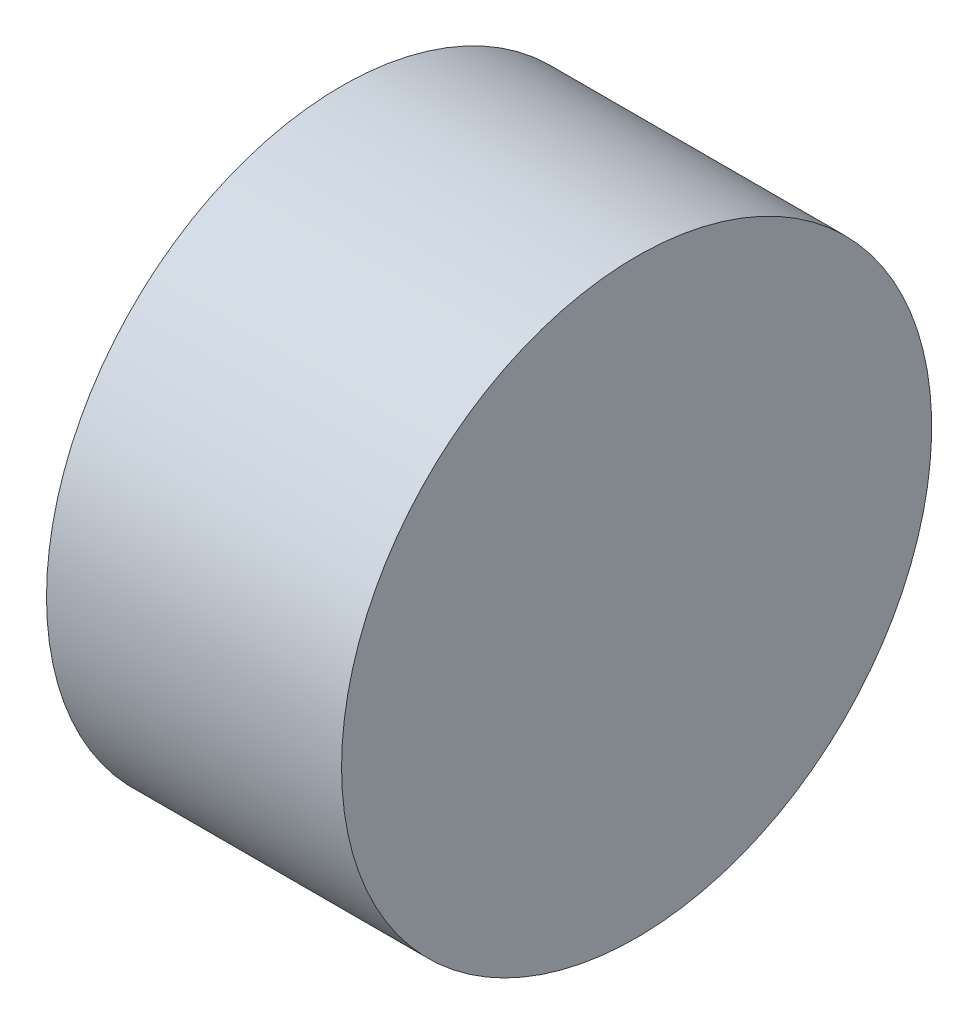
ISO-10303-21;
HEADER;
FILE_DESCRIPTION(('STEP AP214'),'2;1');
FILE_NAME('part.step','',(''),(''),'','','');
FILE_SCHEMA(('AUTOMOTIVE_DESIGN { 1 0 10303 214 1 1 1 1 }'));
ENDSEC;
DATA;
#1=APPLICATION_CONTEXT('core data for automotive mechanical design processes');
#2=APPLICATION_PROTOCOL_DEFINITION('international standard','automotive_design',2000,#1);
#3=PRODUCT_CONTEXT('',#1,'mechanical');
#4=PRODUCT('Part','Part','',(#3));
#5=PRODUCT_RELATED_PRODUCT_CATEGORY('part','',(#4));
#6=PRODUCT_DEFINITION_FORMATION('','',#4);
#7=PRODUCT_DEFINITION_CONTEXT('part definition',#1,'design');
#8=PRODUCT_DEFINITION('design','',#6,#7);
#9=PRODUCT_DEFINITION_SHAPE('','',#8);
#10=(LENGTH_UNIT() NAMED_UNIT(*) SI_UNIT(.MILLI.,.METRE.));
#11=(NAMED_UNIT(*) PLANE_ANGLE_UNIT() SI_UNIT($,.RADIAN.));
#12=(NAMED_UNIT(*) SI_UNIT($,.STERADIAN.) SOLID_ANGLE_UNIT());
#13=UNCERTAINTY_MEASURE_WITH_UNIT(LENGTH_MEASURE(1.E-05),#10,'distance_accuracy_value','');
#14=(GEOMETRIC_REPRESENTATION_CONTEXT(3) GLOBAL_UNCERTAINTY_ASSIGNED_CONTEXT((#13)) GLOBAL_UNIT_ASSIGNED_CONTEXT((#10,
#11,#12)) REPRESENTATION_CONTEXT('',''));
#15=CARTESIAN_POINT('',(0.,0.,0.));
#16=DIRECTION('',(0.,0.,1.));
#17=DIRECTION('',(1.,0.,0.));
#18=AXIS2_PLACEMENT_3D('',#15,#16,#17);
#19=CARTESIAN_POINT('',(13.5,12.7,0.));
#20=DIRECTION('',(0.,-1.,0.));
#21=DIRECTION('',(0.,0.,-1.));
#22=AXIS2_PLACEMENT_3D('',#19,#20,#21);
#23=PLANE('',#22);
#24=DIRECTION('',(0.,0.,-1.));
#25=VECTOR('',#24,1.);
#26=CARTESIAN_POINT('',(13.5,12.7,0.));
#27=LINE('',#26,#25);
#28=CARTESIAN_POINT('',(13.5,12.7,25.));
#29=VERTEX_POINT('',#28);
#30=CARTESIAN_POINT('',(13.5,12.7,-25.));
#31=VERTEX_POINT('',#30);
#32=EDGE_CURVE('E80',#29,#31,#27,.T.);
#33=ORIENTED_EDGE('',*,*,#32,.T.);
#34=CARTESIAN_POINT('',(13.5,12.7,0.));
#35=DIRECTION('',(0.,1.,0.));
#36=DIRECTION('',(0.,0.,-1.));
#37=AXIS2_PLACEMENT_3D('',#34,#35,#36);
#38=CIRCLE('',#37,25.);
#39=EDGE_CURVE('E59',#31,#29,#38,.T.);
#40=ORIENTED_EDGE('',*,*,#39,.T.);
#41=EDGE_LOOP('',(#33,#40));
#42=FACE_BOUND('',#41,.T.);
#43=CARTESIAN_POINT('',(0.,12.7,0.));
#44=DIRECTION('',(0.,1.,0.));
#45=DIRECTION('',(0.,0.,1.));
#46=AXIS2_PLACEMENT_3D('',#43,#44,#45);
#47=CIRCLE('',#46,3.75);
#48=CARTESIAN_POINT('',(0.,12.7,3.75));
#49=VERTEX_POINT('',#48);
#50=EDGE_CURVE('E75',#49,#49,#47,.T.);
#51=ORIENTED_EDGE('',*,*,#50,.F.);
#52=EDGE_LOOP('',(#51));
#53=FACE_BOUND('',#52,.T.);
#54=ADVANCED_FACE('F43',(#42,#53),#23,.F.);
#55=CARTESIAN_POINT('',(13.5,-12.7,0.));
#56=DIRECTION('',(0.,-1.,0.));
#57=DIRECTION('',(0.,0.,-1.));
#58=AXIS2_PLACEMENT_3D('',#55,#56,#57);
#59=PLANE('',#58);
#60=DIRECTION('',(0.,0.,-1.));
#61=VECTOR('',#60,1.);
#62=CARTESIAN_POINT('',(13.5,-12.7,0.));
#63=LINE('',#62,#61);
#64=CARTESIAN_POINT('',(13.5,-12.7,25.));
#65=VERTEX_POINT('',#64);
#66=CARTESIAN_POINT('',(13.5,-12.7,-25.));
#67=VERTEX_POINT('',#66);
#68=EDGE_CURVE('E68',#65,#67,#63,.T.);
#69=ORIENTED_EDGE('',*,*,#68,.F.);
#70=CARTESIAN_POINT('',(13.5,-12.7,0.));
#71=DIRECTION('',(0.,1.,0.));
#72=DIRECTION('',(0.,0.,-1.));
#73=AXIS2_PLACEMENT_3D('',#70,#71,#72);
#74=CIRCLE('',#73,25.);
#75=EDGE_CURVE('E74',#67,#65,#74,.T.);
#76=ORIENTED_EDGE('',*,*,#75,.F.);
#77=EDGE_LOOP('',(#69,#76));
#78=FACE_BOUND('',#77,.T.);
#79=CARTESIAN_POINT('',(0.,-12.7,0.));
#80=DIRECTION('',(0.,1.,0.));
#81=DIRECTION('',(0.,0.,1.));
#82=AXIS2_PLACEMENT_3D('',#79,#80,#81);
#83=CIRCLE('',#82,3.75);
#84=CARTESIAN_POINT('',(0.,-12.7,3.75));
#85=VERTEX_POINT('',#84);
#86=EDGE_CURVE('E85',#85,#85,#83,.T.);
#87=ORIENTED_EDGE('',*,*,#86,.T.);
#88=EDGE_LOOP('',(#87));
#89=FACE_BOUND('',#88,.T.);
#90=ADVANCED_FACE('F72',(#78,#89),#59,.T.);
#91=CARTESIAN_POINT('',(13.5,12.7,0.));
#92=DIRECTION('',(-1.,0.,0.));
#93=DIRECTION('',(0.,0.,1.));
#94=AXIS2_PLACEMENT_3D('',#91,#92,#93);
#95=PLANE('',#94);
#96=ORIENTED_EDGE('',*,*,#68,.T.);
#97=DIRECTION('',(0.,-1.,0.));
#98=VECTOR('',#97,1.);
#99=CARTESIAN_POINT('',(13.5,12.7,-25.));
#100=LINE('',#99,#98);
#101=EDGE_CURVE('E12',#31,#67,#100,.T.);
#102=ORIENTED_EDGE('',*,*,#101,.F.);
#103=ORIENTED_EDGE('',*,*,#32,.F.);
#104=DIRECTION('',(0.,-1.,0.));
#105=VECTOR('',#104,1.);
#106=CARTESIAN_POINT('',(13.5,12.7,25.));
#107=LINE('',#106,#105);
#108=EDGE_CURVE('E52',#29,#65,#107,.T.);
#109=ORIENTED_EDGE('',*,*,#108,.T.);
#110=EDGE_LOOP('',(#96,#102,#103,#109));
#111=FACE_BOUND('',#110,.T.);
#112=ADVANCED_FACE('F45',(#111),#95,.F.);
#113=CARTESIAN_POINT('',(13.5,12.7,0.));
#114=DIRECTION('',(0.,-1.,0.));
#115=DIRECTION('',(0.,0.,-1.));
#116=AXIS2_PLACEMENT_3D('',#113,#114,#115);
#117=CYLINDRICAL_SURFACE('',#116,25.);
#118=ORIENTED_EDGE('',*,*,#75,.T.);
#119=ORIENTED_EDGE('',*,*,#108,.F.);
#120=ORIENTED_EDGE('',*,*,#39,.F.);
#121=ORIENTED_EDGE('',*,*,#101,.T.);
#122=EDGE_LOOP('',(#118,#119,#120,#121));
#123=FACE_BOUND('',#122,.T.);
#124=ADVANCED_FACE('F78',(#123),#117,.T.);
#125=CARTESIAN_POINT('',(0.,12.7,0.));
#126=DIRECTION('',(0.,-1.,0.));
#127=DIRECTION('',(0.,0.,-1.));
#128=AXIS2_PLACEMENT_3D('',#125,#126,#127);
#129=CYLINDRICAL_SURFACE('',#128,3.75);
#130=ORIENTED_EDGE('',*,*,#50,.T.);
#131=EDGE_LOOP('',(#130));
#132=FACE_BOUND('',#131,.T.);
#133=ORIENTED_EDGE('',*,*,#86,.F.);
#134=EDGE_LOOP('',(#133));
#135=FACE_BOUND('',#134,.T.);
#136=ADVANCED_FACE('F91',(#132,#135),#129,.F.);
#137=CLOSED_SHELL('',(#54,#90,#112,#124,#136));
#138=MANIFOLD_SOLID_BREP('B2',#137);
#139=CARTESIAN_POINT('',(38.1,0.,0.));
#140=DIRECTION('',(-1.,0.,0.));
#141=DIRECTION('',(0.,0.,1.));
#142=AXIS2_PLACEMENT_3D('',#139,#140,#141);
#143=CYLINDRICAL_SURFACE('',#142,76.2);
#144=CARTESIAN_POINT('',(38.1,0.,0.));
#145=DIRECTION('',(1.,0.,0.));
#146=DIRECTION('',(0.,0.,-1.));
#147=AXIS2_PLACEMENT_3D('',#144,#145,#146);
#148=CIRCLE('',#147,76.2);
#149=CARTESIAN_POINT('',(38.1,0.,76.2));
#150=VERTEX_POINT('',#149);
#151=EDGE_CURVE('E42',#150,#150,#148,.T.);
#152=CARTESIAN_POINT('',(-38.1,0.,0.));
#153=DIRECTION('',(1.,0.,0.));
#154=DIRECTION('',(0.,0.,-1.));
#155=AXIS2_PLACEMENT_3D('',#152,#153,#154);
#156=CIRCLE('',#155,76.2);
#157=CARTESIAN_POINT('',(-38.1,0.,76.2));
#158=VERTEX_POINT('',#157);
#159=EDGE_CURVE('E142',#158,#158,#156,.T.);
#160=CARTESIAN_POINT('',(38.1,0.,76.2));
#161=CARTESIAN_POINT('',(37.30625,0.,76.2));
#162=CARTESIAN_POINT('',(36.5125,0.,76.2));
#163=CARTESIAN_POINT('',(34.925,0.,76.2));
#164=CARTESIAN_POINT('',(34.13125,0.,76.2));
#165=CARTESIAN_POINT('',(32.54375,0.,76.2));
#166=CARTESIAN_POINT('',(31.75,0.,76.2));
#167=CARTESIAN_POINT('',(30.1625,0.,76.2));
#168=CARTESIAN_POINT('',(29.36875,0.,76.2));
#169=CARTESIAN_POINT('',(27.78125,0.,76.2));
#170=CARTESIAN_POINT('',(26.9875,0.,76.2));
#171=CARTESIAN_POINT('',(25.4,0.,76.2));
#172=CARTESIAN_POINT('',(24.60625,0.,76.2));
#173=CARTESIAN_POINT('',(23.01875,0.,76.2));
#174=CARTESIAN_POINT('',(22.225,0.,76.2));
#175=CARTESIAN_POINT('',(20.6375,0.,76.2));
#176=CARTESIAN_POINT('',(19.84375,0.,76.2));
#177=CARTESIAN_POINT('',(18.25625,0.,76.2));
#178=CARTESIAN_POINT('',(17.4625,0.,76.2));
#179=CARTESIAN_POINT('',(15.875,0.,76.2));
#180=CARTESIAN_POINT('',(15.08125,0.,76.2));
#181=CARTESIAN_POINT('',(13.49375,0.,76.2));
#182=CARTESIAN_POINT('',(12.7,0.,76.2));
#183=CARTESIAN_POINT('',(11.1125,0.,76.2));
#184=CARTESIAN_POINT('',(10.31875,0.,76.2));
#185=CARTESIAN_POINT('',(8.73124999999999,0.,76.2));
#186=CARTESIAN_POINT('',(7.93749999999999,0.,76.2));
#187=CARTESIAN_POINT('',(6.35,0.,76.2));
#188=CARTESIAN_POINT('',(5.55625,0.,76.2));
#189=CARTESIAN_POINT('',(3.96875,0.,76.2));
#190=CARTESIAN_POINT('',(3.175,0.,76.2));
#191=CARTESIAN_POINT('',(1.5875,0.,76.2));
#192=CARTESIAN_POINT('',(0.793750000000001,0.,76.2));
#193=CARTESIAN_POINT('',(-0.793750000000001,0.,76.2));
#194=CARTESIAN_POINT('',(-1.5875,0.,76.2));
#195=CARTESIAN_POINT('',(-3.175,0.,76.2));
#196=CARTESIAN_POINT('',(-3.96875,0.,76.2));
#197=CARTESIAN_POINT('',(-5.55625,0.,76.2));
#198=CARTESIAN_POINT('',(-6.35,0.,76.2));
#199=CARTESIAN_POINT('',(-7.93750000000001,0.,76.2));
#200=CARTESIAN_POINT('',(-8.73125,0.,76.2));
#201=CARTESIAN_POINT('',(-10.31875,0.,76.2));
#202=CARTESIAN_POINT('',(-11.1125,0.,76.2));
#203=CARTESIAN_POINT('',(-12.7,0.,76.2));
#204=CARTESIAN_POINT('',(-13.49375,0.,76.2));
#205=CARTESIAN_POINT('',(-15.08125,0.,76.2));
#206=CARTESIAN_POINT('',(-15.875,0.,76.2));
#207=CARTESIAN_POINT('',(-17.4625,0.,76.2));
#208=CARTESIAN_POINT('',(-18.25625,0.,76.2));
#209=CARTESIAN_POINT('',(-19.84375,0.,76.2));
#210=CARTESIAN_POINT('',(-20.6375,0.,76.2));
#211=CARTESIAN_POINT('',(-22.225,0.,76.2));
#212=CARTESIAN_POINT('',(-23.01875,0.,76.2));
#213=CARTESIAN_POINT('',(-24.60625,0.,76.2));
#214=CARTESIAN_POINT('',(-25.4,0.,76.2));
#215=CARTESIAN_POINT('',(-26.9875,0.,76.2));
#216=CARTESIAN_POINT('',(-27.78125,0.,76.2));
#217=CARTESIAN_POINT('',(-29.36875,0.,76.2));
#218=CARTESIAN_POINT('',(-30.1625,0.,76.2));
#219=CARTESIAN_POINT('',(-31.75,0.,76.2));
#220=CARTESIAN_POINT('',(-32.54375,0.,76.2));
#221=CARTESIAN_POINT('',(-34.13125,0.,76.2));
#222=CARTESIAN_POINT('',(-34.925,0.,76.2));
#223=CARTESIAN_POINT('',(-36.5125,0.,76.2));
#224=CARTESIAN_POINT('',(-37.30625,0.,76.2));
#225=CARTESIAN_POINT('',(-38.1,0.,76.2));
#226=B_SPLINE_CURVE_WITH_KNOTS('',3,(#160,#161,#162,#163,#164,#165,#166,#167,#168,#169,#170,
#171,#172,#173,#174,#175,#176,#177,#178,#179,#180,#181,#182,#183,#184,#185,#186,#187,#188,#189,
#190,#191,#192,#193,#194,#195,#196,#197,#198,#199,#200,#201,#202,#203,#204,#205,#206,#207,#208,
#209,#210,#211,#212,#213,#214,#215,#216,#217,#218,#219,#220,#221,#222,#223,#224,#225),
.UNSPECIFIED.,.F.,.F.,(4,2,2,2,2,2,2,2,2,2,2,2,2,2,2,2,2,2,2,2,2,2,2,2,2,2,2,2,2,2,2,2,4),(0.,
2.38125,4.7625,7.14375,9.52500000000001,11.90625,14.2875,16.66875,19.05,21.43125,23.8125,
26.19375,28.575,30.95625,33.3375,35.71875,38.1,40.48125,42.8625,45.24375,47.625,50.00625,
52.3875,54.76875,57.15,59.53125,61.9125,64.29375,66.675,69.05625,71.4375,73.81875,76.2),.UNSPECIFIED.);
#227=EDGE_CURVE('BSEAM139',#150,#158,#226,.T.);
#228=ORIENTED_EDGE('',*,*,#151,.F.);
#229=ORIENTED_EDGE('',*,*,#159,.T.);
#230=ORIENTED_EDGE('',*,*,#227,.T.);
#231=ORIENTED_EDGE('',*,*,#227,.F.);
#232=EDGE_LOOP('',(#228,#230,#229,#231));
#233=FACE_BOUND('',#232,.T.);
#234=ADVANCED_FACE('F139',(#233),#143,.T.);
#235=CARTESIAN_POINT('',(38.1,0.,0.));
#236=DIRECTION('',(1.,0.,0.));
#237=DIRECTION('',(0.,0.,-1.));
#238=AXIS2_PLACEMENT_3D('',#235,#236,#237);
#239=PLANE('',#238);
#240=ORIENTED_EDGE('',*,*,#151,.T.);
#241=EDGE_LOOP('',(#240));
#242=FACE_BOUND('',#241,.T.);
#243=ADVANCED_FACE('F168',(#242),#239,.T.);
#244=CARTESIAN_POINT('',(-38.1,0.,0.));
#245=DIRECTION('',(1.,0.,0.));
#246=DIRECTION('',(0.,0.,-1.));
#247=AXIS2_PLACEMENT_3D('',#244,#245,#246);
#248=PLANE('',#247);
#249=CARTESIAN_POINT('',(-38.1,0.,0.));
#250=DIRECTION('',(-1.,0.,0.));
#251=DIRECTION('',(0.,0.,1.));
#252=AXIS2_PLACEMENT_3D('',#249,#250,#251);
#253=CIRCLE('',#252,63.5);
#254=CARTESIAN_POINT('',(-38.1,0.,63.5));
#255=VERTEX_POINT('',#254);
#256=EDGE_CURVE('E151',#255,#255,#253,.T.);
#257=ORIENTED_EDGE('',*,*,#256,.F.);
#258=EDGE_LOOP('',(#257));
#259=FACE_BOUND('',#258,.T.);
#260=ORIENTED_EDGE('',*,*,#159,.F.);
#261=EDGE_LOOP('',(#260));
#262=FACE_BOUND('',#261,.T.);
#263=ADVANCED_FACE('F162',(#259,#262),#248,.F.);
#264=CARTESIAN_POINT('',(13.5,0.,0.));
#265=DIRECTION('',(-1.,0.,0.));
#266=DIRECTION('',(0.,0.,1.));
#267=AXIS2_PLACEMENT_3D('',#264,#265,#266);
#268=CYLINDRICAL_SURFACE('',#267,63.5);
#269=CARTESIAN_POINT('',(13.5,0.,0.));
#270=DIRECTION('',(-1.,0.,0.));
#271=DIRECTION('',(0.,0.,1.));
#272=AXIS2_PLACEMENT_3D('',#269,#270,#271);
#273=CIRCLE('',#272,63.5);
#274=CARTESIAN_POINT('',(13.5,0.,63.5));
#275=VERTEX_POINT('',#274);
#276=EDGE_CURVE('E149',#275,#275,#273,.T.);
#277=CARTESIAN_POINT('',(13.5,0.,63.5));
#278=CARTESIAN_POINT('',(12.9625,0.,63.5));
#279=CARTESIAN_POINT('',(12.425,0.,63.5));
#280=CARTESIAN_POINT('',(11.35,0.,63.5));
#281=CARTESIAN_POINT('',(10.8125,0.,63.5));
#282=CARTESIAN_POINT('',(9.7375,0.,63.5));
#283=CARTESIAN_POINT('',(9.2,0.,63.5));
#284=CARTESIAN_POINT('',(8.125,0.,63.5));
#285=CARTESIAN_POINT('',(7.5875,0.,63.5));
#286=CARTESIAN_POINT('',(6.5125,0.,63.5));
#287=CARTESIAN_POINT('',(5.975,0.,63.5));
#288=CARTESIAN_POINT('',(4.9,0.,63.5));
#289=CARTESIAN_POINT('',(4.3625,0.,63.5));
#290=CARTESIAN_POINT('',(3.2875,0.,63.5));
#291=CARTESIAN_POINT('',(2.75,0.,63.5));
#292=CARTESIAN_POINT('',(1.675,0.,63.5));
#293=CARTESIAN_POINT('',(1.1375,0.,63.5));
#294=CARTESIAN_POINT('',(0.0624999999999983,0.,63.5));
#295=CARTESIAN_POINT('',(-0.475000000000001,0.,63.5));
#296=CARTESIAN_POINT('',(-1.55,0.,63.5));
#297=CARTESIAN_POINT('',(-2.0875,0.,63.5));
#298=CARTESIAN_POINT('',(-3.1625,0.,63.5));
#299=CARTESIAN_POINT('',(-3.7,0.,63.5));
#300=CARTESIAN_POINT('',(-4.775,0.,63.5));
#301=CARTESIAN_POINT('',(-5.3125,0.,63.5));
#302=CARTESIAN_POINT('',(-6.3875,0.,63.5));
#303=CARTESIAN_POINT('',(-6.925,0.,63.5));
#304=CARTESIAN_POINT('',(-8.,0.,63.5));
#305=CARTESIAN_POINT('',(-8.5375,0.,63.5));
#306=CARTESIAN_POINT('',(-9.6125,0.,63.5));
#307=CARTESIAN_POINT('',(-10.15,0.,63.5));
#308=CARTESIAN_POINT('',(-11.225,0.,63.5));
#309=CARTESIAN_POINT('',(-11.7625,0.,63.5));
#310=CARTESIAN_POINT('',(-12.8375,0.,63.5));
#311=CARTESIAN_POINT('',(-13.375,0.,63.5));
#312=CARTESIAN_POINT('',(-14.45,0.,63.5));
#313=CARTESIAN_POINT('',(-14.9875,0.,63.5));
#314=CARTESIAN_POINT('',(-16.0625,0.,63.5));
#315=CARTESIAN_POINT('',(-16.6,0.,63.5));
#316=CARTESIAN_POINT('',(-17.675,0.,63.5));
#317=CARTESIAN_POINT('',(-18.2125,0.,63.5));
#318=CARTESIAN_POINT('',(-19.2875,0.,63.5));
#319=CARTESIAN_POINT('',(-19.825,0.,63.5));
#320=CARTESIAN_POINT('',(-20.9,0.,63.5));
#321=CARTESIAN_POINT('',(-21.4375,0.,63.5));
#322=CARTESIAN_POINT('',(-22.5125,0.,63.5));
#323=CARTESIAN_POINT('',(-23.05,0.,63.5));
#324=CARTESIAN_POINT('',(-24.125,0.,63.5));
#325=CARTESIAN_POINT('',(-24.6625,0.,63.5));
#326=CARTESIAN_POINT('',(-25.7375,0.,63.5));
#327=CARTESIAN_POINT('',(-26.275,0.,63.5));
#328=CARTESIAN_POINT('',(-27.35,0.,63.5));
#329=CARTESIAN_POINT('',(-27.8875,0.,63.5));
#330=CARTESIAN_POINT('',(-28.9625,0.,63.5));
#331=CARTESIAN_POINT('',(-29.5,0.,63.5));
#332=CARTESIAN_POINT('',(-30.575,0.,63.5));
#333=CARTESIAN_POINT('',(-31.1125,0.,63.5));
#334=CARTESIAN_POINT('',(-32.1875,0.,63.5));
#335=CARTESIAN_POINT('',(-32.725,0.,63.5));
#336=CARTESIAN_POINT('',(-33.8,0.,63.5));
#337=CARTESIAN_POINT('',(-34.3375,0.,63.5));
#338=CARTESIAN_POINT('',(-35.4125,0.,63.5));
#339=CARTESIAN_POINT('',(-35.95,0.,63.5));
#340=CARTESIAN_POINT('',(-37.025,0.,63.5));
#341=CARTESIAN_POINT('',(-37.5625,0.,63.5));
#342=CARTESIAN_POINT('',(-38.1,0.,63.5));
#343=B_SPLINE_CURVE_WITH_KNOTS('',3,(#277,#278,#279,#280,#281,#282,#283,#284,#285,#286,#287,
#288,#289,#290,#291,#292,#293,#294,#295,#296,#297,#298,#299,#300,#301,#302,#303,#304,#305,#306,
#307,#308,#309,#310,#311,#312,#313,#314,#315,#316,#317,#318,#319,#320,#321,#322,#323,#324,#325,
#326,#327,#328,#329,#330,#331,#332,#333,#334,#335,#336,#337,#338,#339,#340,#341,#342),
.UNSPECIFIED.,.F.,.F.,(4,2,2,2,2,2,2,2,2,2,2,2,2,2,2,2,2,2,2,2,2,2,2,2,2,2,2,2,2,2,2,2,4),(0.,
1.6125,3.225,4.8375,6.45,8.0625,9.675,11.2875,12.9,14.5125,16.125,17.7375,19.35,20.9625,22.575,
24.1875,25.8,27.4125,29.025,30.6375,32.25,33.8625,35.475,37.0875,38.7,40.3125,41.925,43.5375,
45.15,46.7625,48.375,49.9875,51.6),.UNSPECIFIED.);
#344=EDGE_CURVE('BSEAM159',#275,#255,#343,.T.);
#345=ORIENTED_EDGE('',*,*,#276,.F.);
#346=ORIENTED_EDGE('',*,*,#256,.T.);
#347=ORIENTED_EDGE('',*,*,#344,.T.);
#348=ORIENTED_EDGE('',*,*,#344,.F.);
#349=EDGE_LOOP('',(#345,#347,#346,#348));
#350=FACE_BOUND('',#349,.T.);
#351=ADVANCED_FACE('F159',(#350),#268,.F.);
#352=CARTESIAN_POINT('',(13.5,0.,0.));
#353=DIRECTION('',(-1.,0.,0.));
#354=DIRECTION('',(0.,0.,1.));
#355=AXIS2_PLACEMENT_3D('',#352,#353,#354);
#356=PLANE('',#355);
#357=ORIENTED_EDGE('',*,*,#276,.T.);
#358=EDGE_LOOP('',(#357));
#359=FACE_BOUND('',#358,.T.);
#360=ADVANCED_FACE('F157',(#359),#356,.T.);
#361=CLOSED_SHELL('',(#234,#243,#263,#351,#360));
#362=MANIFOLD_SOLID_BREP('B6',#361);
#363=ADVANCED_BREP_SHAPE_REPRESENTATION('',(#18,#138,#362),#14);
#364=SHAPE_DEFINITION_REPRESENTATION(#9,#363);
ENDSEC;
END-ISO-10303-21;
